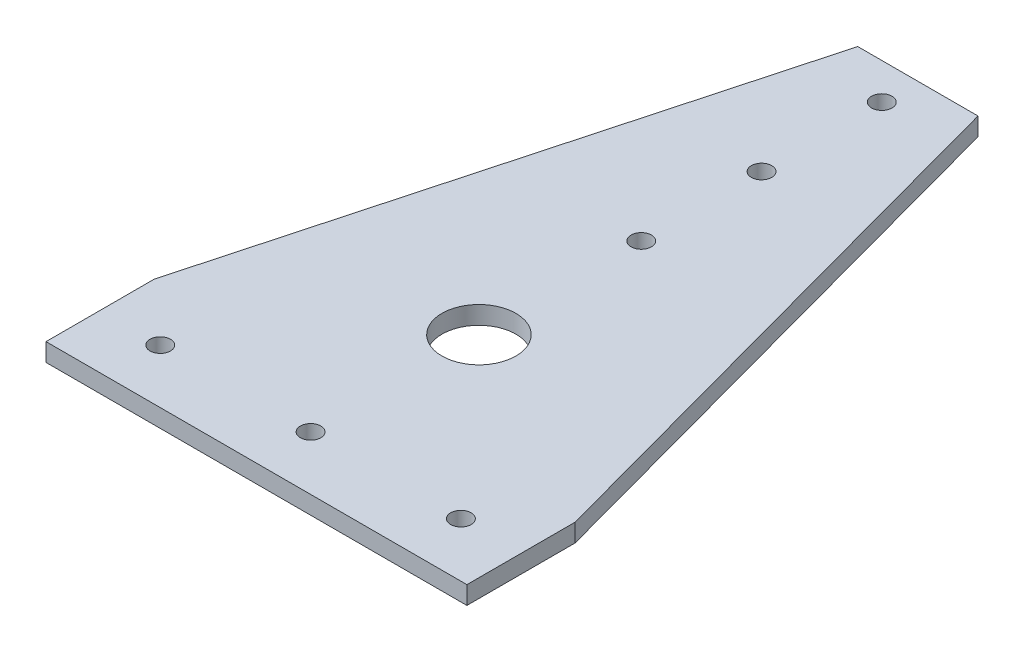
ISO-10303-21;
HEADER;
FILE_DESCRIPTION(('STEP AP214'),'2;1');
FILE_NAME('part.step','',(''),(''),'','','');
FILE_SCHEMA(('AUTOMOTIVE_DESIGN { 1 0 10303 214 1 1 1 1 }'));
ENDSEC;
DATA;
#1=APPLICATION_CONTEXT('core data for automotive mechanical design processes');
#2=APPLICATION_PROTOCOL_DEFINITION('international standard','automotive_design',2000,#1);
#3=PRODUCT_CONTEXT('',#1,'mechanical');
#4=PRODUCT('Part','Part','',(#3));
#5=PRODUCT_RELATED_PRODUCT_CATEGORY('part','',(#4));
#6=PRODUCT_DEFINITION_FORMATION('','',#4);
#7=PRODUCT_DEFINITION_CONTEXT('part definition',#1,'design');
#8=PRODUCT_DEFINITION('design','',#6,#7);
#9=PRODUCT_DEFINITION_SHAPE('','',#8);
#10=(LENGTH_UNIT() NAMED_UNIT(*) SI_UNIT(.MILLI.,.METRE.));
#11=(NAMED_UNIT(*) PLANE_ANGLE_UNIT() SI_UNIT($,.RADIAN.));
#12=(NAMED_UNIT(*) SI_UNIT($,.STERADIAN.) SOLID_ANGLE_UNIT());
#13=UNCERTAINTY_MEASURE_WITH_UNIT(LENGTH_MEASURE(1.E-05),#10,'distance_accuracy_value','');
#14=(GEOMETRIC_REPRESENTATION_CONTEXT(3) GLOBAL_UNCERTAINTY_ASSIGNED_CONTEXT((#13)) GLOBAL_UNIT_ASSIGNED_CONTEXT((#10,
#11,#12)) REPRESENTATION_CONTEXT('',''));
#15=CARTESIAN_POINT('',(0.,0.,0.));
#16=DIRECTION('',(0.,0.,1.));
#17=DIRECTION('',(1.,0.,0.));
#18=AXIS2_PLACEMENT_3D('',#15,#16,#17);
#19=CARTESIAN_POINT('',(0.,3.,0.));
#20=DIRECTION('',(0.,-1.,0.));
#21=DIRECTION('',(0.,0.,-1.));
#22=AXIS2_PLACEMENT_3D('',#19,#20,#21);
#23=PLANE('',#22);
#24=DIRECTION('',(-0.26222974761173,0.,0.965005471211168));
#25=VECTOR('',#24,1.);
#26=CARTESIAN_POINT('',(-10.,3.,-101.));
#27=LINE('',#26,#25);
#28=CARTESIAN_POINT('',(-10.,3.,-101.));
#29=VERTEX_POINT('',#28);
#30=CARTESIAN_POINT('',(-35.,3.,-8.99999999999999));
#31=VERTEX_POINT('',#30);
#32=EDGE_CURVE('E155',#29,#31,#27,.T.);
#33=ORIENTED_EDGE('',*,*,#32,.T.);
#34=DIRECTION('',(0.,0.,1.));
#35=VECTOR('',#34,1.);
#36=CARTESIAN_POINT('',(-35.,3.,9.00000000000001));
#37=LINE('',#36,#35);
#38=CARTESIAN_POINT('',(-35.,3.,9.00000000000001));
#39=VERTEX_POINT('',#38);
#40=EDGE_CURVE('E99',#31,#39,#37,.T.);
#41=ORIENTED_EDGE('',*,*,#40,.T.);
#42=DIRECTION('',(1.,0.,0.));
#43=VECTOR('',#42,1.);
#44=CARTESIAN_POINT('',(35.,3.,9.));
#45=LINE('',#44,#43);
#46=CARTESIAN_POINT('',(35.,3.,9.));
#47=VERTEX_POINT('',#46);
#48=EDGE_CURVE('E114',#39,#47,#45,.T.);
#49=ORIENTED_EDGE('',*,*,#48,.T.);
#50=DIRECTION('',(0.,0.,-1.));
#51=VECTOR('',#50,1.);
#52=CARTESIAN_POINT('',(35.,3.,9.));
#53=LINE('',#52,#51);
#54=CARTESIAN_POINT('',(35.,3.,-9.00000000000002));
#55=VERTEX_POINT('',#54);
#56=EDGE_CURVE('E110',#47,#55,#53,.T.);
#57=ORIENTED_EDGE('',*,*,#56,.T.);
#58=DIRECTION('',(-0.262229747611731,0.,-0.965005471211168));
#59=VECTOR('',#58,1.);
#60=CARTESIAN_POINT('',(9.99999999999999,3.,-101.));
#61=LINE('',#60,#59);
#62=CARTESIAN_POINT('',(9.99999999999999,3.,-101.));
#63=VERTEX_POINT('',#62);
#64=EDGE_CURVE('E112',#55,#63,#61,.T.);
#65=ORIENTED_EDGE('',*,*,#64,.T.);
#66=DIRECTION('',(-1.,0.,0.));
#67=VECTOR('',#66,1.);
#68=CARTESIAN_POINT('',(9.99999999999999,3.,-101.));
#69=LINE('',#68,#67);
#70=EDGE_CURVE('E64',#63,#29,#69,.T.);
#71=ORIENTED_EDGE('',*,*,#70,.T.);
#72=EDGE_LOOP('',(#33,#41,#49,#57,#65,#71));
#73=FACE_BOUND('',#72,.T.);
#74=CARTESIAN_POINT('',(0.,3.,0.));
#75=DIRECTION('',(0.,1.,0.));
#76=DIRECTION('',(0.,0.,1.));
#77=AXIS2_PLACEMENT_3D('',#74,#75,#76);
#78=CIRCLE('',#77,1.7);
#79=CARTESIAN_POINT('',(0.,3.,1.7));
#80=VERTEX_POINT('',#79);
#81=EDGE_CURVE('E140',#80,#80,#78,.T.);
#82=ORIENTED_EDGE('',*,*,#81,.F.);
#83=EDGE_LOOP('',(#82));
#84=FACE_BOUND('',#83,.T.);
#85=CARTESIAN_POINT('',(-25.,3.,0.));
#86=DIRECTION('',(0.,1.,0.));
#87=DIRECTION('',(0.,0.,1.));
#88=AXIS2_PLACEMENT_3D('',#85,#86,#87);
#89=CIRCLE('',#88,1.7);
#90=CARTESIAN_POINT('',(-25.,3.,1.7));
#91=VERTEX_POINT('',#90);
#92=EDGE_CURVE('E257',#91,#91,#89,.T.);
#93=ORIENTED_EDGE('',*,*,#92,.F.);
#94=EDGE_LOOP('',(#93));
#95=FACE_BOUND('',#94,.T.);
#96=CARTESIAN_POINT('',(25.,3.,0.));
#97=DIRECTION('',(0.,1.,0.));
#98=DIRECTION('',(0.,0.,1.));
#99=AXIS2_PLACEMENT_3D('',#96,#97,#98);
#100=CIRCLE('',#99,1.7);
#101=CARTESIAN_POINT('',(25.,3.,1.7));
#102=VERTEX_POINT('',#101);
#103=EDGE_CURVE('E252',#102,#102,#100,.T.);
#104=ORIENTED_EDGE('',*,*,#103,.F.);
#105=EDGE_LOOP('',(#104));
#106=FACE_BOUND('',#105,.T.);
#107=CARTESIAN_POINT('',(0.,3.,-28.));
#108=DIRECTION('',(0.,1.,0.));
#109=DIRECTION('',(0.,0.,1.));
#110=AXIS2_PLACEMENT_3D('',#107,#108,#109);
#111=CIRCLE('',#110,6.15);
#112=CARTESIAN_POINT('',(0.,3.,-21.85));
#113=VERTEX_POINT('',#112);
#114=EDGE_CURVE('E241',#113,#113,#111,.T.);
#115=ORIENTED_EDGE('',*,*,#114,.F.);
#116=EDGE_LOOP('',(#115));
#117=FACE_BOUND('',#116,.T.);
#118=CARTESIAN_POINT('',(0.,3.,-55.));
#119=DIRECTION('',(0.,1.,0.));
#120=DIRECTION('',(0.,0.,1.));
#121=AXIS2_PLACEMENT_3D('',#118,#119,#120);
#122=CIRCLE('',#121,1.7);
#123=CARTESIAN_POINT('',(0.,3.,-53.3));
#124=VERTEX_POINT('',#123);
#125=EDGE_CURVE('E237',#124,#124,#122,.T.);
#126=ORIENTED_EDGE('',*,*,#125,.F.);
#127=EDGE_LOOP('',(#126));
#128=FACE_BOUND('',#127,.T.);
#129=CARTESIAN_POINT('',(0.,3.,-75.));
#130=DIRECTION('',(0.,1.,0.));
#131=DIRECTION('',(0.,0.,1.));
#132=AXIS2_PLACEMENT_3D('',#129,#130,#131);
#133=CIRCLE('',#132,1.7);
#134=CARTESIAN_POINT('',(0.,3.,-73.3));
#135=VERTEX_POINT('',#134);
#136=EDGE_CURVE('E229',#135,#135,#133,.T.);
#137=ORIENTED_EDGE('',*,*,#136,.F.);
#138=EDGE_LOOP('',(#137));
#139=FACE_BOUND('',#138,.T.);
#140=CARTESIAN_POINT('',(0.,3.,-95.));
#141=DIRECTION('',(0.,1.,0.));
#142=DIRECTION('',(0.,0.,1.));
#143=AXIS2_PLACEMENT_3D('',#140,#141,#142);
#144=CIRCLE('',#143,1.7);
#145=CARTESIAN_POINT('',(0.,3.,-93.3));
#146=VERTEX_POINT('',#145);
#147=EDGE_CURVE('E220',#146,#146,#144,.T.);
#148=ORIENTED_EDGE('',*,*,#147,.F.);
#149=EDGE_LOOP('',(#148));
#150=FACE_BOUND('',#149,.T.);
#151=ADVANCED_FACE('F44',(#73,#84,#95,#106,#117,#128,#139,#150),#23,.F.);
#152=CARTESIAN_POINT('',(0.,0.,0.));
#153=DIRECTION('',(0.,-1.,0.));
#154=DIRECTION('',(0.,0.,-1.));
#155=AXIS2_PLACEMENT_3D('',#152,#153,#154);
#156=PLANE('',#155);
#157=CARTESIAN_POINT('',(0.,0.,-75.));
#158=DIRECTION('',(0.,1.,0.));
#159=DIRECTION('',(0.,0.,1.));
#160=AXIS2_PLACEMENT_3D('',#157,#158,#159);
#161=CIRCLE('',#160,1.7);
#162=CARTESIAN_POINT('',(0.,0.,-73.3));
#163=VERTEX_POINT('',#162);
#164=EDGE_CURVE('E223',#163,#163,#161,.T.);
#165=ORIENTED_EDGE('',*,*,#164,.T.);
#166=EDGE_LOOP('',(#165));
#167=FACE_BOUND('',#166,.T.);
#168=CARTESIAN_POINT('',(0.,0.,-28.));
#169=DIRECTION('',(0.,1.,0.));
#170=DIRECTION('',(0.,0.,1.));
#171=AXIS2_PLACEMENT_3D('',#168,#169,#170);
#172=CIRCLE('',#171,6.15);
#173=CARTESIAN_POINT('',(0.,0.,-21.85));
#174=VERTEX_POINT('',#173);
#175=EDGE_CURVE('E238',#174,#174,#172,.T.);
#176=ORIENTED_EDGE('',*,*,#175,.T.);
#177=EDGE_LOOP('',(#176));
#178=FACE_BOUND('',#177,.T.);
#179=CARTESIAN_POINT('',(-25.,0.,0.));
#180=DIRECTION('',(0.,1.,0.));
#181=DIRECTION('',(0.,0.,1.));
#182=AXIS2_PLACEMENT_3D('',#179,#180,#181);
#183=CIRCLE('',#182,1.7);
#184=CARTESIAN_POINT('',(-25.,0.,1.7));
#185=VERTEX_POINT('',#184);
#186=EDGE_CURVE('E258',#185,#185,#183,.T.);
#187=ORIENTED_EDGE('',*,*,#186,.T.);
#188=EDGE_LOOP('',(#187));
#189=FACE_BOUND('',#188,.T.);
#190=DIRECTION('',(-0.26222974761173,0.,0.965005471211168));
#191=VECTOR('',#190,1.);
#192=CARTESIAN_POINT('',(-10.,0.,-101.));
#193=LINE('',#192,#191);
#194=CARTESIAN_POINT('',(-10.,0.,-101.));
#195=VERTEX_POINT('',#194);
#196=CARTESIAN_POINT('',(-35.,0.,-8.99999999999999));
#197=VERTEX_POINT('',#196);
#198=EDGE_CURVE('E133',#195,#197,#193,.T.);
#199=ORIENTED_EDGE('',*,*,#198,.F.);
#200=DIRECTION('',(-1.,0.,0.));
#201=VECTOR('',#200,1.);
#202=CARTESIAN_POINT('',(9.99999999999999,0.,-101.));
#203=LINE('',#202,#201);
#204=CARTESIAN_POINT('',(9.99999999999999,0.,-101.));
#205=VERTEX_POINT('',#204);
#206=EDGE_CURVE('E95',#205,#195,#203,.T.);
#207=ORIENTED_EDGE('',*,*,#206,.F.);
#208=DIRECTION('',(-0.262229747611731,0.,-0.965005471211168));
#209=VECTOR('',#208,1.);
#210=CARTESIAN_POINT('',(9.99999999999999,0.,-101.));
#211=LINE('',#210,#209);
#212=CARTESIAN_POINT('',(35.,0.,-9.00000000000002));
#213=VERTEX_POINT('',#212);
#214=EDGE_CURVE('E88',#213,#205,#211,.T.);
#215=ORIENTED_EDGE('',*,*,#214,.F.);
#216=DIRECTION('',(0.,0.,-1.));
#217=VECTOR('',#216,1.);
#218=CARTESIAN_POINT('',(35.,0.,9.));
#219=LINE('',#218,#217);
#220=CARTESIAN_POINT('',(35.,0.,9.));
#221=VERTEX_POINT('',#220);
#222=EDGE_CURVE('E122',#221,#213,#219,.T.);
#223=ORIENTED_EDGE('',*,*,#222,.F.);
#224=DIRECTION('',(1.,0.,0.));
#225=VECTOR('',#224,1.);
#226=CARTESIAN_POINT('',(35.,0.,9.));
#227=LINE('',#226,#225);
#228=CARTESIAN_POINT('',(-35.,0.,9.00000000000001));
#229=VERTEX_POINT('',#228);
#230=EDGE_CURVE('E141',#229,#221,#227,.T.);
#231=ORIENTED_EDGE('',*,*,#230,.F.);
#232=DIRECTION('',(0.,0.,1.));
#233=VECTOR('',#232,1.);
#234=CARTESIAN_POINT('',(-35.,0.,9.00000000000001));
#235=LINE('',#234,#233);
#236=EDGE_CURVE('E138',#197,#229,#235,.T.);
#237=ORIENTED_EDGE('',*,*,#236,.F.);
#238=EDGE_LOOP('',(#199,#207,#215,#223,#231,#237));
#239=FACE_BOUND('',#238,.T.);
#240=CARTESIAN_POINT('',(0.,0.,0.));
#241=DIRECTION('',(0.,1.,0.));
#242=DIRECTION('',(0.,0.,1.));
#243=AXIS2_PLACEMENT_3D('',#240,#241,#242);
#244=CIRCLE('',#243,1.7);
#245=CARTESIAN_POINT('',(0.,0.,1.7));
#246=VERTEX_POINT('',#245);
#247=EDGE_CURVE('E262',#246,#246,#244,.T.);
#248=ORIENTED_EDGE('',*,*,#247,.T.);
#249=EDGE_LOOP('',(#248));
#250=FACE_BOUND('',#249,.T.);
#251=CARTESIAN_POINT('',(25.,0.,0.));
#252=DIRECTION('',(0.,1.,0.));
#253=DIRECTION('',(0.,0.,1.));
#254=AXIS2_PLACEMENT_3D('',#251,#252,#253);
#255=CIRCLE('',#254,1.7);
#256=CARTESIAN_POINT('',(25.,0.,1.7));
#257=VERTEX_POINT('',#256);
#258=EDGE_CURVE('E249',#257,#257,#255,.T.);
#259=ORIENTED_EDGE('',*,*,#258,.T.);
#260=EDGE_LOOP('',(#259));
#261=FACE_BOUND('',#260,.T.);
#262=CARTESIAN_POINT('',(0.,0.,-55.));
#263=DIRECTION('',(0.,1.,0.));
#264=DIRECTION('',(0.,0.,1.));
#265=AXIS2_PLACEMENT_3D('',#262,#263,#264);
#266=CIRCLE('',#265,1.7);
#267=CARTESIAN_POINT('',(0.,0.,-53.3));
#268=VERTEX_POINT('',#267);
#269=EDGE_CURVE('E232',#268,#268,#266,.T.);
#270=ORIENTED_EDGE('',*,*,#269,.T.);
#271=EDGE_LOOP('',(#270));
#272=FACE_BOUND('',#271,.T.);
#273=CARTESIAN_POINT('',(0.,0.,-95.));
#274=DIRECTION('',(0.,1.,0.));
#275=DIRECTION('',(0.,0.,1.));
#276=AXIS2_PLACEMENT_3D('',#273,#274,#275);
#277=CIRCLE('',#276,1.7);
#278=CARTESIAN_POINT('',(0.,0.,-93.3));
#279=VERTEX_POINT('',#278);
#280=EDGE_CURVE('E219',#279,#279,#277,.T.);
#281=ORIENTED_EDGE('',*,*,#280,.T.);
#282=EDGE_LOOP('',(#281));
#283=FACE_BOUND('',#282,.T.);
#284=ADVANCED_FACE('F164',(#167,#178,#189,#239,#250,#261,#272,#283),#156,.T.);
#285=CARTESIAN_POINT('',(-10.,3.,-101.));
#286=DIRECTION('',(0.965005471211168,0.,0.26222974761173));
#287=DIRECTION('',(0.26222974761173,0.,-0.965005471211168));
#288=AXIS2_PLACEMENT_3D('',#285,#286,#287);
#289=PLANE('',#288);
#290=ORIENTED_EDGE('',*,*,#198,.T.);
#291=DIRECTION('',(0.,-1.,0.));
#292=VECTOR('',#291,1.);
#293=CARTESIAN_POINT('',(-35.,3.,-8.99999999999999));
#294=LINE('',#293,#292);
#295=EDGE_CURVE('E11',#31,#197,#294,.T.);
#296=ORIENTED_EDGE('',*,*,#295,.F.);
#297=ORIENTED_EDGE('',*,*,#32,.F.);
#298=DIRECTION('',(0.,-1.,0.));
#299=VECTOR('',#298,1.);
#300=CARTESIAN_POINT('',(-10.,3.,-101.));
#301=LINE('',#300,#299);
#302=EDGE_CURVE('E132',#29,#195,#301,.T.);
#303=ORIENTED_EDGE('',*,*,#302,.T.);
#304=EDGE_LOOP('',(#290,#296,#297,#303));
#305=FACE_BOUND('',#304,.T.);
#306=ADVANCED_FACE('F50',(#305),#289,.F.);
#307=CARTESIAN_POINT('',(-35.,3.,9.00000000000001));
#308=DIRECTION('',(1.,0.,0.));
#309=DIRECTION('',(0.,0.,-1.));
#310=AXIS2_PLACEMENT_3D('',#307,#308,#309);
#311=PLANE('',#310);
#312=ORIENTED_EDGE('',*,*,#236,.T.);
#313=DIRECTION('',(0.,-1.,0.));
#314=VECTOR('',#313,1.);
#315=CARTESIAN_POINT('',(-35.,3.,9.00000000000001));
#316=LINE('',#315,#314);
#317=EDGE_CURVE('E54',#39,#229,#316,.T.);
#318=ORIENTED_EDGE('',*,*,#317,.F.);
#319=ORIENTED_EDGE('',*,*,#40,.F.);
#320=ORIENTED_EDGE('',*,*,#295,.T.);
#321=EDGE_LOOP('',(#312,#318,#319,#320));
#322=FACE_BOUND('',#321,.T.);
#323=ADVANCED_FACE('F365',(#322),#311,.F.);
#324=CARTESIAN_POINT('',(35.,3.,9.));
#325=DIRECTION('',(0.,0.,-1.));
#326=DIRECTION('',(-1.,0.,0.));
#327=AXIS2_PLACEMENT_3D('',#324,#325,#326);
#328=PLANE('',#327);
#329=ORIENTED_EDGE('',*,*,#230,.T.);
#330=DIRECTION('',(0.,-1.,0.));
#331=VECTOR('',#330,1.);
#332=CARTESIAN_POINT('',(35.,3.,9.));
#333=LINE('',#332,#331);
#334=EDGE_CURVE('E123',#47,#221,#333,.T.);
#335=ORIENTED_EDGE('',*,*,#334,.F.);
#336=ORIENTED_EDGE('',*,*,#48,.F.);
#337=ORIENTED_EDGE('',*,*,#317,.T.);
#338=EDGE_LOOP('',(#329,#335,#336,#337));
#339=FACE_BOUND('',#338,.T.);
#340=ADVANCED_FACE('F165',(#339),#328,.F.);
#341=CARTESIAN_POINT('',(35.,3.,9.));
#342=DIRECTION('',(-1.,0.,0.));
#343=DIRECTION('',(0.,0.,1.));
#344=AXIS2_PLACEMENT_3D('',#341,#342,#343);
#345=PLANE('',#344);
#346=ORIENTED_EDGE('',*,*,#222,.T.);
#347=DIRECTION('',(0.,-1.,0.));
#348=VECTOR('',#347,1.);
#349=CARTESIAN_POINT('',(35.,3.,-9.00000000000002));
#350=LINE('',#349,#348);
#351=EDGE_CURVE('E116',#55,#213,#350,.T.);
#352=ORIENTED_EDGE('',*,*,#351,.F.);
#353=ORIENTED_EDGE('',*,*,#56,.F.);
#354=ORIENTED_EDGE('',*,*,#334,.T.);
#355=EDGE_LOOP('',(#346,#352,#353,#354));
#356=FACE_BOUND('',#355,.T.);
#357=ADVANCED_FACE('F118',(#356),#345,.F.);
#358=CARTESIAN_POINT('',(9.99999999999999,3.,-101.));
#359=DIRECTION('',(-0.965005471211168,0.,0.262229747611731));
#360=DIRECTION('',(0.262229747611731,0.,0.965005471211168));
#361=AXIS2_PLACEMENT_3D('',#358,#359,#360);
#362=PLANE('',#361);
#363=ORIENTED_EDGE('',*,*,#214,.T.);
#364=DIRECTION('',(0.,-1.,0.));
#365=VECTOR('',#364,1.);
#366=CARTESIAN_POINT('',(9.99999999999999,3.,-101.));
#367=LINE('',#366,#365);
#368=EDGE_CURVE('E125',#63,#205,#367,.T.);
#369=ORIENTED_EDGE('',*,*,#368,.F.);
#370=ORIENTED_EDGE('',*,*,#64,.F.);
#371=ORIENTED_EDGE('',*,*,#351,.T.);
#372=EDGE_LOOP('',(#363,#369,#370,#371));
#373=FACE_BOUND('',#372,.T.);
#374=ADVANCED_FACE('F130',(#373),#362,.F.);
#375=CARTESIAN_POINT('',(9.99999999999999,3.,-101.));
#376=DIRECTION('',(0.,0.,1.));
#377=DIRECTION('',(1.,0.,0.));
#378=AXIS2_PLACEMENT_3D('',#375,#376,#377);
#379=PLANE('',#378);
#380=ORIENTED_EDGE('',*,*,#206,.T.);
#381=ORIENTED_EDGE('',*,*,#302,.F.);
#382=ORIENTED_EDGE('',*,*,#70,.F.);
#383=ORIENTED_EDGE('',*,*,#368,.T.);
#384=EDGE_LOOP('',(#380,#381,#382,#383));
#385=FACE_BOUND('',#384,.T.);
#386=ADVANCED_FACE('F168',(#385),#379,.F.);
#387=CARTESIAN_POINT('',(0.,3.,0.));
#388=DIRECTION('',(0.,-1.,0.));
#389=DIRECTION('',(0.,0.,-1.));
#390=AXIS2_PLACEMENT_3D('',#387,#388,#389);
#391=CYLINDRICAL_SURFACE('',#390,1.7);
#392=ORIENTED_EDGE('',*,*,#81,.T.);
#393=EDGE_LOOP('',(#392));
#394=FACE_BOUND('',#393,.T.);
#395=ORIENTED_EDGE('',*,*,#247,.F.);
#396=EDGE_LOOP('',(#395));
#397=FACE_BOUND('',#396,.T.);
#398=ADVANCED_FACE('F175',(#394,#397),#391,.F.);
#399=CARTESIAN_POINT('',(-25.,3.,0.));
#400=DIRECTION('',(0.,-1.,0.));
#401=DIRECTION('',(0.,0.,-1.));
#402=AXIS2_PLACEMENT_3D('',#399,#400,#401);
#403=CYLINDRICAL_SURFACE('',#402,1.7);
#404=ORIENTED_EDGE('',*,*,#92,.T.);
#405=EDGE_LOOP('',(#404));
#406=FACE_BOUND('',#405,.T.);
#407=ORIENTED_EDGE('',*,*,#186,.F.);
#408=EDGE_LOOP('',(#407));
#409=FACE_BOUND('',#408,.T.);
#410=ADVANCED_FACE('F179',(#406,#409),#403,.F.);
#411=CARTESIAN_POINT('',(25.,3.,0.));
#412=DIRECTION('',(0.,-1.,0.));
#413=DIRECTION('',(0.,0.,-1.));
#414=AXIS2_PLACEMENT_3D('',#411,#412,#413);
#415=CYLINDRICAL_SURFACE('',#414,1.7);
#416=ORIENTED_EDGE('',*,*,#103,.T.);
#417=EDGE_LOOP('',(#416));
#418=FACE_BOUND('',#417,.T.);
#419=ORIENTED_EDGE('',*,*,#258,.F.);
#420=EDGE_LOOP('',(#419));
#421=FACE_BOUND('',#420,.T.);
#422=ADVANCED_FACE('F192',(#418,#421),#415,.F.);
#423=CARTESIAN_POINT('',(0.,3.,-28.));
#424=DIRECTION('',(0.,-1.,0.));
#425=DIRECTION('',(0.,0.,-1.));
#426=AXIS2_PLACEMENT_3D('',#423,#424,#425);
#427=CYLINDRICAL_SURFACE('',#426,6.15);
#428=ORIENTED_EDGE('',*,*,#114,.T.);
#429=EDGE_LOOP('',(#428));
#430=FACE_BOUND('',#429,.T.);
#431=ORIENTED_EDGE('',*,*,#175,.F.);
#432=EDGE_LOOP('',(#431));
#433=FACE_BOUND('',#432,.T.);
#434=ADVANCED_FACE('F198',(#430,#433),#427,.F.);
#435=CARTESIAN_POINT('',(0.,3.,-55.));
#436=DIRECTION('',(0.,-1.,0.));
#437=DIRECTION('',(0.,0.,-1.));
#438=AXIS2_PLACEMENT_3D('',#435,#436,#437);
#439=CYLINDRICAL_SURFACE('',#438,1.7);
#440=ORIENTED_EDGE('',*,*,#125,.T.);
#441=EDGE_LOOP('',(#440));
#442=FACE_BOUND('',#441,.T.);
#443=ORIENTED_EDGE('',*,*,#269,.F.);
#444=EDGE_LOOP('',(#443));
#445=FACE_BOUND('',#444,.T.);
#446=ADVANCED_FACE('F199',(#442,#445),#439,.F.);
#447=CARTESIAN_POINT('',(0.,3.,-75.));
#448=DIRECTION('',(0.,-1.,0.));
#449=DIRECTION('',(0.,0.,-1.));
#450=AXIS2_PLACEMENT_3D('',#447,#448,#449);
#451=CYLINDRICAL_SURFACE('',#450,1.7);
#452=ORIENTED_EDGE('',*,*,#136,.T.);
#453=EDGE_LOOP('',(#452));
#454=FACE_BOUND('',#453,.T.);
#455=ORIENTED_EDGE('',*,*,#164,.F.);
#456=EDGE_LOOP('',(#455));
#457=FACE_BOUND('',#456,.T.);
#458=ADVANCED_FACE('F204',(#454,#457),#451,.F.);
#459=CARTESIAN_POINT('',(0.,3.,-95.));
#460=DIRECTION('',(0.,-1.,0.));
#461=DIRECTION('',(0.,0.,-1.));
#462=AXIS2_PLACEMENT_3D('',#459,#460,#461);
#463=CYLINDRICAL_SURFACE('',#462,1.7);
#464=ORIENTED_EDGE('',*,*,#147,.T.);
#465=EDGE_LOOP('',(#464));
#466=FACE_BOUND('',#465,.T.);
#467=ORIENTED_EDGE('',*,*,#280,.F.);
#468=EDGE_LOOP('',(#467));
#469=FACE_BOUND('',#468,.T.);
#470=ADVANCED_FACE('F208',(#466,#469),#463,.F.);
#471=CLOSED_SHELL('',(#151,#284,#306,#323,#340,#357,#374,#386,#398,#410,#422,#434,#446,#458,#470));
#472=MANIFOLD_SOLID_BREP('B2',#471);
#473=ADVANCED_BREP_SHAPE_REPRESENTATION('',(#18,#472),#14);
#474=SHAPE_DEFINITION_REPRESENTATION(#9,#473);
ENDSEC;
END-ISO-10303-21;
